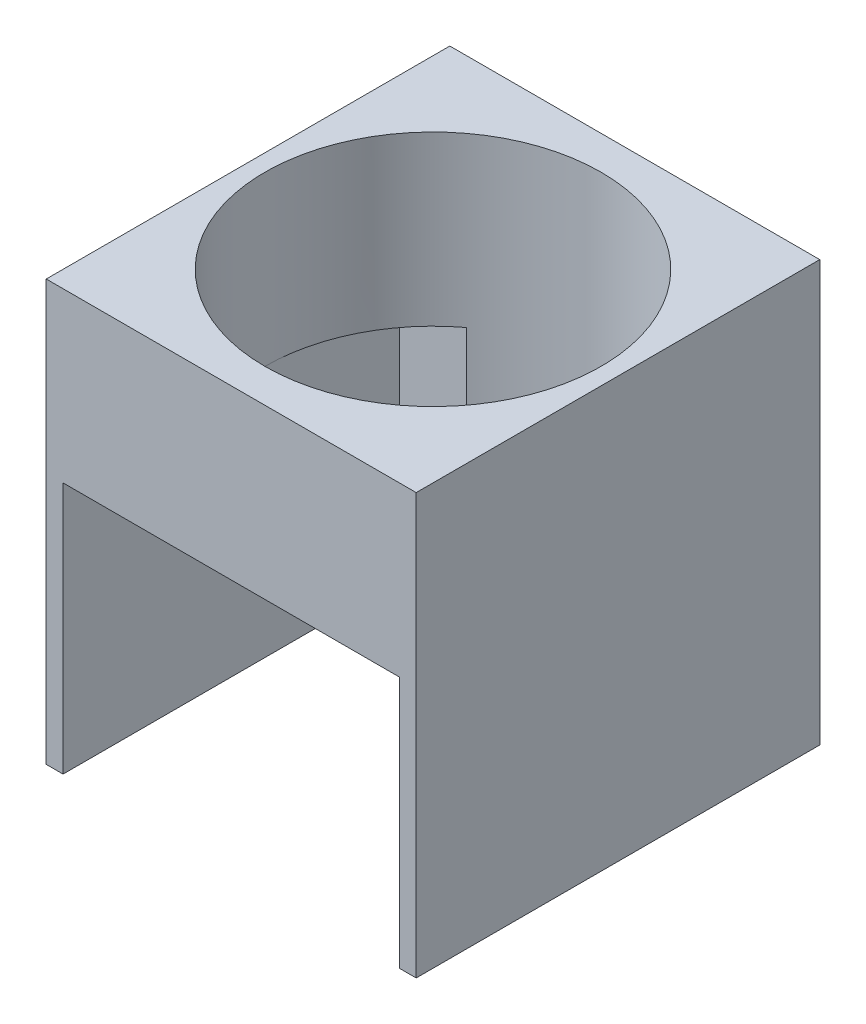
ISO-10303-21;
HEADER;
FILE_DESCRIPTION(('STEP AP214'),'2;1');
FILE_NAME('part.step','',(''),(''),'','','');
FILE_SCHEMA(('AUTOMOTIVE_DESIGN { 1 0 10303 214 1 1 1 1 }'));
ENDSEC;
DATA;
#1=APPLICATION_CONTEXT('core data for automotive mechanical design processes');
#2=APPLICATION_PROTOCOL_DEFINITION('international standard','automotive_design',2000,#1);
#3=PRODUCT_CONTEXT('',#1,'mechanical');
#4=PRODUCT('Part','Part','',(#3));
#5=PRODUCT_RELATED_PRODUCT_CATEGORY('part','',(#4));
#6=PRODUCT_DEFINITION_FORMATION('','',#4);
#7=PRODUCT_DEFINITION_CONTEXT('part definition',#1,'design');
#8=PRODUCT_DEFINITION('design','',#6,#7);
#9=PRODUCT_DEFINITION_SHAPE('','',#8);
#10=(LENGTH_UNIT() NAMED_UNIT(*) SI_UNIT(.MILLI.,.METRE.));
#11=(NAMED_UNIT(*) PLANE_ANGLE_UNIT() SI_UNIT($,.RADIAN.));
#12=(NAMED_UNIT(*) SI_UNIT($,.STERADIAN.) SOLID_ANGLE_UNIT());
#13=UNCERTAINTY_MEASURE_WITH_UNIT(LENGTH_MEASURE(1.E-05),#10,'distance_accuracy_value','');
#14=(GEOMETRIC_REPRESENTATION_CONTEXT(3) GLOBAL_UNCERTAINTY_ASSIGNED_CONTEXT((#13)) GLOBAL_UNIT_ASSIGNED_CONTEXT((#10,
#11,#12)) REPRESENTATION_CONTEXT('',''));
#15=CARTESIAN_POINT('',(0.,0.,0.));
#16=DIRECTION('',(0.,0.,1.));
#17=DIRECTION('',(1.,0.,0.));
#18=AXIS2_PLACEMENT_3D('',#15,#16,#17);
#19=CARTESIAN_POINT('',(0.,530.,0.));
#20=DIRECTION('',(0.,0.,-1.));
#21=DIRECTION('',(-1.,0.,0.));
#22=AXIS2_PLACEMENT_3D('',#19,#20,#21);
#23=PLANE('',#22);
#24=DIRECTION('',(0.,-1.,0.));
#25=VECTOR('',#24,1.);
#26=CARTESIAN_POINT('',(115.,530.,0.));
#27=LINE('',#26,#25);
#28=CARTESIAN_POINT('',(115.,530.,0.));
#29=VERTEX_POINT('',#28);
#30=CARTESIAN_POINT('',(115.,405.,0.));
#31=VERTEX_POINT('',#30);
#32=EDGE_CURVE('E159',#29,#31,#27,.T.);
#33=ORIENTED_EDGE('',*,*,#32,.T.);
#34=DIRECTION('',(1.,0.,0.));
#35=VECTOR('',#34,1.);
#36=CARTESIAN_POINT('',(0.,405.,0.));
#37=LINE('',#36,#35);
#38=CARTESIAN_POINT('',(120.,405.,0.));
#39=VERTEX_POINT('',#38);
#40=EDGE_CURVE('E53',#31,#39,#37,.T.);
#41=ORIENTED_EDGE('',*,*,#40,.T.);
#42=DIRECTION('',(0.,-1.,0.));
#43=VECTOR('',#42,1.);
#44=CARTESIAN_POINT('',(120.,280.,0.));
#45=LINE('',#44,#43);
#46=CARTESIAN_POINT('',(120.,480.,0.));
#47=VERTEX_POINT('',#46);
#48=EDGE_CURVE('E175',#47,#39,#45,.T.);
#49=ORIENTED_EDGE('',*,*,#48,.F.);
#50=DIRECTION('',(-1.,0.,0.));
#51=VECTOR('',#50,1.);
#52=CARTESIAN_POINT('',(120.,480.,0.));
#53=LINE('',#52,#51);
#54=CARTESIAN_POINT('',(220.,480.,0.));
#55=VERTEX_POINT('',#54);
#56=EDGE_CURVE('E188',#55,#47,#53,.T.);
#57=ORIENTED_EDGE('',*,*,#56,.F.);
#58=DIRECTION('',(0.,1.,0.));
#59=VECTOR('',#58,1.);
#60=CARTESIAN_POINT('',(220.,280.,0.));
#61=LINE('',#60,#59);
#62=CARTESIAN_POINT('',(220.,405.,0.));
#63=VERTEX_POINT('',#62);
#64=EDGE_CURVE('E185',#63,#55,#61,.T.);
#65=ORIENTED_EDGE('',*,*,#64,.F.);
#66=CARTESIAN_POINT('',(225.,405.,0.));
#67=VERTEX_POINT('',#66);
#68=EDGE_CURVE('E145',#63,#67,#37,.T.);
#69=ORIENTED_EDGE('',*,*,#68,.T.);
#70=DIRECTION('',(0.,1.,0.));
#71=VECTOR('',#70,1.);
#72=CARTESIAN_POINT('',(225.,530.,0.));
#73=LINE('',#72,#71);
#74=CARTESIAN_POINT('',(225.,530.,0.));
#75=VERTEX_POINT('',#74);
#76=EDGE_CURVE('E136',#67,#75,#73,.T.);
#77=ORIENTED_EDGE('',*,*,#76,.T.);
#78=DIRECTION('',(1.,0.,0.));
#79=VECTOR('',#78,1.);
#80=CARTESIAN_POINT('',(0.,530.,0.));
#81=LINE('',#80,#79);
#82=EDGE_CURVE('E199',#29,#75,#81,.T.);
#83=ORIENTED_EDGE('',*,*,#82,.F.);
#84=EDGE_LOOP('',(#33,#41,#49,#57,#65,#69,#77,#83));
#85=FACE_BOUND('',#84,.T.);
#86=ADVANCED_FACE('F38',(#85),#23,.F.);
#87=CARTESIAN_POINT('',(120.,480.,-100.));
#88=DIRECTION('',(0.,1.,0.));
#89=DIRECTION('',(-1.,0.,0.));
#90=AXIS2_PLACEMENT_3D('',#87,#88,#89);
#91=PLANE('',#90);
#92=DIRECTION('',(0.,0.,1.));
#93=VECTOR('',#92,1.);
#94=CARTESIAN_POINT('',(220.,480.,-100.));
#95=LINE('',#94,#93);
#96=CARTESIAN_POINT('',(220.,480.,-100.));
#97=VERTEX_POINT('',#96);
#98=CARTESIAN_POINT('',(220.,480.,-60.));
#99=VERTEX_POINT('',#98);
#100=EDGE_CURVE('E201',#97,#99,#95,.T.);
#101=ORIENTED_EDGE('',*,*,#100,.T.);
#102=CARTESIAN_POINT('',(170.,480.,-60.));
#103=DIRECTION('',(0.,1.,0.));
#104=DIRECTION('',(-1.,0.,0.));
#105=AXIS2_PLACEMENT_3D('',#102,#103,#104);
#106=CIRCLE('',#105,50.);
#107=CARTESIAN_POINT('',(200.,480.,-100.));
#108=VERTEX_POINT('',#107);
#109=EDGE_CURVE('E170',#99,#108,#106,.T.);
#110=ORIENTED_EDGE('',*,*,#109,.T.);
#111=DIRECTION('',(-1.,0.,0.));
#112=VECTOR('',#111,1.);
#113=CARTESIAN_POINT('',(120.,480.,-100.));
#114=LINE('',#113,#112);
#115=EDGE_CURVE('E176',#97,#108,#114,.T.);
#116=ORIENTED_EDGE('',*,*,#115,.F.);
#117=EDGE_LOOP('',(#101,#110,#116));
#118=FACE_BOUND('',#117,.T.);
#119=ADVANCED_FACE('F272',(#118),#91,.F.);
#120=DIRECTION('',(0.,0.,1.));
#121=VECTOR('',#120,1.);
#122=CARTESIAN_POINT('',(120.,480.,-100.));
#123=LINE('',#122,#121);
#124=CARTESIAN_POINT('',(120.,480.,-60.));
#125=VERTEX_POINT('',#124);
#126=EDGE_CURVE('E200',#125,#47,#123,.T.);
#127=ORIENTED_EDGE('',*,*,#126,.F.);
#128=EDGE_CURVE('E169',#125,#99,#106,.T.);
#129=ORIENTED_EDGE('',*,*,#128,.T.);
#130=EDGE_CURVE('E184',#99,#55,#95,.T.);
#131=ORIENTED_EDGE('',*,*,#130,.T.);
#132=ORIENTED_EDGE('',*,*,#56,.T.);
#133=EDGE_LOOP('',(#127,#129,#131,#132));
#134=FACE_BOUND('',#133,.T.);
#135=ADVANCED_FACE('F277',(#134),#91,.F.);
#136=CARTESIAN_POINT('',(0.,0.,-100.));
#137=DIRECTION('',(0.,0.,1.));
#138=DIRECTION('',(1.,0.,0.));
#139=AXIS2_PLACEMENT_3D('',#136,#137,#138);
#140=PLANE('',#139);
#141=DIRECTION('',(-1.,0.,0.));
#142=VECTOR('',#141,1.);
#143=CARTESIAN_POINT('',(0.,405.,-100.));
#144=LINE('',#143,#142);
#145=CARTESIAN_POINT('',(220.,405.,-100.));
#146=VERTEX_POINT('',#145);
#147=CARTESIAN_POINT('',(200.,405.,-100.));
#148=VERTEX_POINT('',#147);
#149=EDGE_CURVE('E238',#146,#148,#144,.T.);
#150=ORIENTED_EDGE('',*,*,#149,.F.);
#151=DIRECTION('',(0.,1.,0.));
#152=VECTOR('',#151,1.);
#153=CARTESIAN_POINT('',(220.,280.,-100.));
#154=LINE('',#153,#152);
#155=EDGE_CURVE('E171',#146,#97,#154,.T.);
#156=ORIENTED_EDGE('',*,*,#155,.T.);
#157=ORIENTED_EDGE('',*,*,#115,.T.);
#158=DIRECTION('',(0.,1.,0.));
#159=VECTOR('',#158,1.);
#160=CARTESIAN_POINT('',(200.,270.,-100.));
#161=LINE('',#160,#159);
#162=EDGE_CURVE('E11',#148,#108,#161,.T.);
#163=ORIENTED_EDGE('',*,*,#162,.F.);
#164=EDGE_LOOP('',(#150,#156,#157,#163));
#165=FACE_BOUND('',#164,.T.);
#166=ADVANCED_FACE('F269',(#165),#140,.T.);
#167=CARTESIAN_POINT('',(0.,530.,-120.));
#168=DIRECTION('',(0.,0.,1.));
#169=DIRECTION('',(1.,0.,0.));
#170=AXIS2_PLACEMENT_3D('',#167,#168,#169);
#171=PLANE('',#170);
#172=DIRECTION('',(0.,-1.,0.));
#173=VECTOR('',#172,1.);
#174=CARTESIAN_POINT('',(225.,280.,-120.));
#175=LINE('',#174,#173);
#176=CARTESIAN_POINT('',(225.,530.,-120.));
#177=VERTEX_POINT('',#176);
#178=CARTESIAN_POINT('',(225.,405.,-120.));
#179=VERTEX_POINT('',#178);
#180=EDGE_CURVE('E134',#177,#179,#175,.T.);
#181=ORIENTED_EDGE('',*,*,#180,.T.);
#182=DIRECTION('',(-1.,0.,0.));
#183=VECTOR('',#182,1.);
#184=CARTESIAN_POINT('',(115.,405.,-120.));
#185=LINE('',#184,#183);
#186=CARTESIAN_POINT('',(115.,405.,-120.));
#187=VERTEX_POINT('',#186);
#188=EDGE_CURVE('E119',#179,#187,#185,.T.);
#189=ORIENTED_EDGE('',*,*,#188,.T.);
#190=DIRECTION('',(0.,1.,0.));
#191=VECTOR('',#190,1.);
#192=CARTESIAN_POINT('',(115.,280.,-120.));
#193=LINE('',#192,#191);
#194=CARTESIAN_POINT('',(115.,530.,-120.));
#195=VERTEX_POINT('',#194);
#196=EDGE_CURVE('E149',#187,#195,#193,.T.);
#197=ORIENTED_EDGE('',*,*,#196,.T.);
#198=DIRECTION('',(-1.,0.,0.));
#199=VECTOR('',#198,1.);
#200=CARTESIAN_POINT('',(0.,530.,-120.));
#201=LINE('',#200,#199);
#202=EDGE_CURVE('E142',#177,#195,#201,.T.);
#203=ORIENTED_EDGE('',*,*,#202,.F.);
#204=EDGE_LOOP('',(#181,#189,#197,#203));
#205=FACE_BOUND('',#204,.T.);
#206=ADVANCED_FACE('F140',(#205),#171,.F.);
#207=CARTESIAN_POINT('',(0.,530.,0.));
#208=DIRECTION('',(0.,-1.,0.));
#209=DIRECTION('',(0.,0.,-1.));
#210=AXIS2_PLACEMENT_3D('',#207,#208,#209);
#211=PLANE('',#210);
#212=CARTESIAN_POINT('',(170.,530.,-60.));
#213=DIRECTION('',(0.,1.,0.));
#214=DIRECTION('',(0.,0.,1.));
#215=AXIS2_PLACEMENT_3D('',#212,#213,#214);
#216=CIRCLE('',#215,50.);
#217=CARTESIAN_POINT('',(170.,530.,-10.));
#218=VERTEX_POINT('',#217);
#219=EDGE_CURVE('E163',#218,#218,#216,.T.);
#220=ORIENTED_EDGE('',*,*,#219,.F.);
#221=EDGE_LOOP('',(#220));
#222=FACE_BOUND('',#221,.T.);
#223=ORIENTED_EDGE('',*,*,#202,.T.);
#224=DIRECTION('',(0.,0.,1.));
#225=VECTOR('',#224,1.);
#226=CARTESIAN_POINT('',(115.,530.,-120.));
#227=LINE('',#226,#225);
#228=EDGE_CURVE('E154',#195,#29,#227,.T.);
#229=ORIENTED_EDGE('',*,*,#228,.T.);
#230=ORIENTED_EDGE('',*,*,#82,.T.);
#231=DIRECTION('',(0.,0.,1.));
#232=VECTOR('',#231,1.);
#233=CARTESIAN_POINT('',(225.,530.,-120.));
#234=LINE('',#233,#232);
#235=EDGE_CURVE('E144',#177,#75,#234,.T.);
#236=ORIENTED_EDGE('',*,*,#235,.F.);
#237=EDGE_LOOP('',(#223,#229,#230,#236));
#238=FACE_BOUND('',#237,.T.);
#239=ADVANCED_FACE('F256',(#222,#238),#211,.F.);
#240=CARTESIAN_POINT('',(120.,280.,-100.));
#241=DIRECTION('',(-1.,0.,0.));
#242=DIRECTION('',(0.,0.,1.));
#243=AXIS2_PLACEMENT_3D('',#240,#241,#242);
#244=PLANE('',#243);
#245=ORIENTED_EDGE('',*,*,#48,.T.);
#246=DIRECTION('',(0.,0.,-1.));
#247=VECTOR('',#246,1.);
#248=CARTESIAN_POINT('',(120.,405.,-100.));
#249=LINE('',#248,#247);
#250=CARTESIAN_POINT('',(120.,405.,-100.));
#251=VERTEX_POINT('',#250);
#252=EDGE_CURVE('E241',#39,#251,#249,.T.);
#253=ORIENTED_EDGE('',*,*,#252,.T.);
#254=DIRECTION('',(0.,-1.,0.));
#255=VECTOR('',#254,1.);
#256=CARTESIAN_POINT('',(120.,280.,-100.));
#257=LINE('',#256,#255);
#258=CARTESIAN_POINT('',(120.,480.,-100.));
#259=VERTEX_POINT('',#258);
#260=EDGE_CURVE('E180',#259,#251,#257,.T.);
#261=ORIENTED_EDGE('',*,*,#260,.F.);
#262=EDGE_CURVE('E195',#259,#125,#123,.T.);
#263=ORIENTED_EDGE('',*,*,#262,.T.);
#264=ORIENTED_EDGE('',*,*,#126,.T.);
#265=EDGE_LOOP('',(#245,#253,#261,#263,#264));
#266=FACE_BOUND('',#265,.T.);
#267=ADVANCED_FACE('F258',(#266),#244,.F.);
#268=CARTESIAN_POINT('',(140.,480.,-100.));
#269=VERTEX_POINT('',#268);
#270=EDGE_CURVE('E174',#269,#259,#114,.T.);
#271=ORIENTED_EDGE('',*,*,#270,.F.);
#272=EDGE_CURVE('E61',#269,#125,#106,.T.);
#273=ORIENTED_EDGE('',*,*,#272,.T.);
#274=ORIENTED_EDGE('',*,*,#262,.F.);
#275=EDGE_LOOP('',(#271,#273,#274));
#276=FACE_BOUND('',#275,.T.);
#277=ADVANCED_FACE('F221',(#276),#91,.F.);
#278=CARTESIAN_POINT('',(220.,280.,-100.));
#279=DIRECTION('',(1.,0.,0.));
#280=DIRECTION('',(0.,0.,-1.));
#281=AXIS2_PLACEMENT_3D('',#278,#279,#280);
#282=PLANE('',#281);
#283=ORIENTED_EDGE('',*,*,#155,.F.);
#284=DIRECTION('',(0.,0.,1.));
#285=VECTOR('',#284,1.);
#286=CARTESIAN_POINT('',(220.,405.,-100.));
#287=LINE('',#286,#285);
#288=EDGE_CURVE('E151',#146,#63,#287,.T.);
#289=ORIENTED_EDGE('',*,*,#288,.T.);
#290=ORIENTED_EDGE('',*,*,#64,.T.);
#291=ORIENTED_EDGE('',*,*,#130,.F.);
#292=ORIENTED_EDGE('',*,*,#100,.F.);
#293=EDGE_LOOP('',(#283,#289,#290,#291,#292));
#294=FACE_BOUND('',#293,.T.);
#295=ADVANCED_FACE('F285',(#294),#282,.F.);
#296=DIRECTION('',(-1.,0.,0.));
#297=VECTOR('',#296,1.);
#298=CARTESIAN_POINT('',(0.,405.,-100.));
#299=LINE('',#298,#297);
#300=CARTESIAN_POINT('',(140.,405.,-100.));
#301=VERTEX_POINT('',#300);
#302=EDGE_CURVE('E219',#301,#251,#299,.T.);
#303=ORIENTED_EDGE('',*,*,#302,.F.);
#304=DIRECTION('',(0.,1.,0.));
#305=VECTOR('',#304,1.);
#306=CARTESIAN_POINT('',(140.,270.,-100.));
#307=LINE('',#306,#305);
#308=EDGE_CURVE('E46',#269,#301,#307,.F.);
#309=ORIENTED_EDGE('',*,*,#308,.F.);
#310=ORIENTED_EDGE('',*,*,#270,.T.);
#311=ORIENTED_EDGE('',*,*,#260,.T.);
#312=EDGE_LOOP('',(#303,#309,#310,#311));
#313=FACE_BOUND('',#312,.T.);
#314=ADVANCED_FACE('F217',(#313),#140,.T.);
#315=CARTESIAN_POINT('',(170.,270.,-60.));
#316=DIRECTION('',(0.,1.,0.));
#317=DIRECTION('',(0.,0.,1.));
#318=AXIS2_PLACEMENT_3D('',#315,#316,#317);
#319=CYLINDRICAL_SURFACE('',#318,50.);
#320=ORIENTED_EDGE('',*,*,#219,.T.);
#321=EDGE_LOOP('',(#320));
#322=FACE_BOUND('',#321,.T.);
#323=ORIENTED_EDGE('',*,*,#308,.T.);
#324=CARTESIAN_POINT('',(170.,405.,-60.));
#325=DIRECTION('',(0.,1.,0.));
#326=DIRECTION('',(0.,0.,1.));
#327=AXIS2_PLACEMENT_3D('',#324,#325,#326);
#328=CIRCLE('',#327,50.);
#329=EDGE_CURVE('E212',#301,#148,#328,.F.);
#330=ORIENTED_EDGE('',*,*,#329,.T.);
#331=ORIENTED_EDGE('',*,*,#162,.T.);
#332=ORIENTED_EDGE('',*,*,#109,.F.);
#333=ORIENTED_EDGE('',*,*,#128,.F.);
#334=ORIENTED_EDGE('',*,*,#272,.F.);
#335=EDGE_LOOP('',(#323,#330,#331,#332,#333,#334));
#336=FACE_BOUND('',#335,.T.);
#337=ADVANCED_FACE('F211',(#322,#336),#319,.F.);
#338=CARTESIAN_POINT('',(225.,280.,-120.));
#339=DIRECTION('',(-1.,0.,0.));
#340=DIRECTION('',(0.,0.,1.));
#341=AXIS2_PLACEMENT_3D('',#338,#339,#340);
#342=PLANE('',#341);
#343=ORIENTED_EDGE('',*,*,#76,.F.);
#344=DIRECTION('',(0.,0.,1.));
#345=VECTOR('',#344,1.);
#346=CARTESIAN_POINT('',(225.,405.,-120.));
#347=LINE('',#346,#345);
#348=EDGE_CURVE('E122',#179,#67,#347,.T.);
#349=ORIENTED_EDGE('',*,*,#348,.F.);
#350=ORIENTED_EDGE('',*,*,#180,.F.);
#351=ORIENTED_EDGE('',*,*,#235,.T.);
#352=EDGE_LOOP('',(#343,#349,#350,#351));
#353=FACE_BOUND('',#352,.T.);
#354=ADVANCED_FACE('F132',(#353),#342,.F.);
#355=CARTESIAN_POINT('',(115.,280.,-120.));
#356=DIRECTION('',(1.,0.,0.));
#357=DIRECTION('',(0.,0.,-1.));
#358=AXIS2_PLACEMENT_3D('',#355,#356,#357);
#359=PLANE('',#358);
#360=ORIENTED_EDGE('',*,*,#196,.F.);
#361=DIRECTION('',(0.,0.,1.));
#362=VECTOR('',#361,1.);
#363=CARTESIAN_POINT('',(115.,405.,-120.));
#364=LINE('',#363,#362);
#365=EDGE_CURVE('E124',#187,#31,#364,.T.);
#366=ORIENTED_EDGE('',*,*,#365,.T.);
#367=ORIENTED_EDGE('',*,*,#32,.F.);
#368=ORIENTED_EDGE('',*,*,#228,.F.);
#369=EDGE_LOOP('',(#360,#366,#367,#368));
#370=FACE_BOUND('',#369,.T.);
#371=ADVANCED_FACE('F251',(#370),#359,.F.);
#372=CARTESIAN_POINT('',(115.,405.,-120.));
#373=DIRECTION('',(0.,1.,0.));
#374=DIRECTION('',(0.,0.,1.));
#375=AXIS2_PLACEMENT_3D('',#372,#373,#374);
#376=PLANE('',#375);
#377=ORIENTED_EDGE('',*,*,#288,.F.);
#378=ORIENTED_EDGE('',*,*,#149,.T.);
#379=ORIENTED_EDGE('',*,*,#329,.F.);
#380=ORIENTED_EDGE('',*,*,#302,.T.);
#381=ORIENTED_EDGE('',*,*,#252,.F.);
#382=ORIENTED_EDGE('',*,*,#40,.F.);
#383=ORIENTED_EDGE('',*,*,#365,.F.);
#384=ORIENTED_EDGE('',*,*,#188,.F.);
#385=ORIENTED_EDGE('',*,*,#348,.T.);
#386=ORIENTED_EDGE('',*,*,#68,.F.);
#387=EDGE_LOOP('',(#377,#378,#379,#380,#381,#382,#383,#384,#385,#386));
#388=FACE_BOUND('',#387,.T.);
#389=ADVANCED_FACE('F121',(#388),#376,.F.);
#390=CLOSED_SHELL('',(#86,#119,#135,#166,#206,#239,#267,#277,#295,#314,#337,#354,#371,#389));
#391=MANIFOLD_SOLID_BREP('B2',#390);
#392=ADVANCED_BREP_SHAPE_REPRESENTATION('',(#18,#391),#14);
#393=SHAPE_DEFINITION_REPRESENTATION(#9,#392);
ENDSEC;
END-ISO-10303-21;
